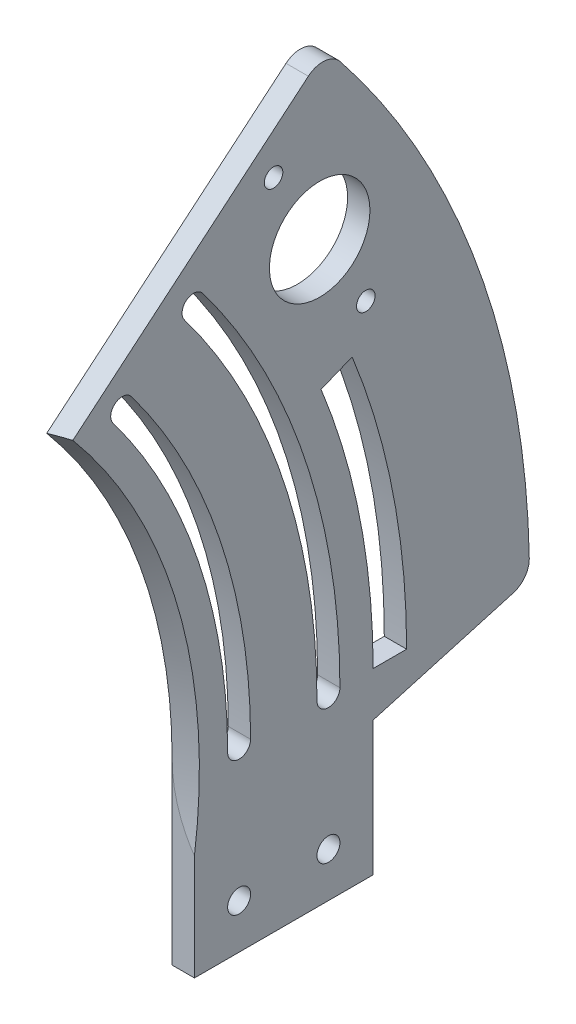
ISO-10303-21;
HEADER;
FILE_DESCRIPTION(('STEP AP214'),'2;1');
FILE_NAME('part.step','',(''),(''),'','','');
FILE_SCHEMA(('AUTOMOTIVE_DESIGN { 1 0 10303 214 1 1 1 1 }'));
ENDSEC;
DATA;
#1=APPLICATION_CONTEXT('core data for automotive mechanical design processes');
#2=APPLICATION_PROTOCOL_DEFINITION('international standard','automotive_design',2000,#1);
#3=PRODUCT_CONTEXT('',#1,'mechanical');
#4=PRODUCT('Part','Part','',(#3));
#5=PRODUCT_RELATED_PRODUCT_CATEGORY('part','',(#4));
#6=PRODUCT_DEFINITION_FORMATION('','',#4);
#7=PRODUCT_DEFINITION_CONTEXT('part definition',#1,'design');
#8=PRODUCT_DEFINITION('design','',#6,#7);
#9=PRODUCT_DEFINITION_SHAPE('','',#8);
#10=(LENGTH_UNIT() NAMED_UNIT(*) SI_UNIT(.MILLI.,.METRE.));
#11=(NAMED_UNIT(*) PLANE_ANGLE_UNIT() SI_UNIT($,.RADIAN.));
#12=(NAMED_UNIT(*) SI_UNIT($,.STERADIAN.) SOLID_ANGLE_UNIT());
#13=UNCERTAINTY_MEASURE_WITH_UNIT(LENGTH_MEASURE(1.E-05),#10,'distance_accuracy_value','');
#14=(GEOMETRIC_REPRESENTATION_CONTEXT(3) GLOBAL_UNCERTAINTY_ASSIGNED_CONTEXT((#13)) GLOBAL_UNIT_ASSIGNED_CONTEXT((#10,
#11,#12)) REPRESENTATION_CONTEXT('',''));
#15=CARTESIAN_POINT('',(0.,0.,0.));
#16=DIRECTION('',(0.,0.,1.));
#17=DIRECTION('',(1.,0.,0.));
#18=AXIS2_PLACEMENT_3D('',#15,#16,#17);
#19=CARTESIAN_POINT('',(6.35,0.,-152.4));
#20=DIRECTION('',(0.,0.,-1.));
#21=DIRECTION('',(0.,1.,0.));
#22=AXIS2_PLACEMENT_3D('',#19,#20,#21);
#23=PLANE('',#22);
#24=CARTESIAN_POINT('',(7.43971542291661,-22.1866370505546,-152.4));
#25=CARTESIAN_POINT('',(7.93666785588586,-22.8156567818333,-152.4));
#26=CARTESIAN_POINT('',(8.45752809363679,-23.42580109558,-152.4));
#27=CARTESIAN_POINT('',(9.54532799602168,-24.6031838854847,-152.4));
#28=CARTESIAN_POINT('',(10.1122499549092,-25.1704386876566,-152.4));
#29=CARTESIAN_POINT('',(11.2905768356218,-26.257465494336,-152.4));
#30=CARTESIAN_POINT('',(11.9020060930652,-26.7772111662092,-152.4));
#31=CARTESIAN_POINT('',(13.1660651043215,-27.763450614783,-152.4));
#32=CARTESIAN_POINT('',(13.8186775769817,-28.2299664998326,-152.4));
#33=CARTESIAN_POINT('',(15.1655425197375,-29.1072372419592,-152.4));
#34=CARTESIAN_POINT('',(15.8600035515539,-29.5176725670453,-152.4));
#35=CARTESIAN_POINT('',(17.2826412717875,-30.2745493064391,-152.4));
#36=CARTESIAN_POINT('',(18.0108030672583,-30.6210186569919,-152.4));
#37=CARTESIAN_POINT('',(19.4958103496898,-31.2455302990343,-152.4));
#38=CARTESIAN_POINT('',(20.2526509932261,-31.5235840859665,-152.4));
#39=CARTESIAN_POINT('',(21.7891063582499,-32.0073614760549,-152.4));
#40=CARTESIAN_POINT('',(22.5687191189811,-32.2130912867826,-152.4));
#41=CARTESIAN_POINT('',(24.0824256917947,-32.5360181627311,-152.4));
#42=CARTESIAN_POINT('',(24.815315465726,-32.6588775236629,-152.4));
#43=CARTESIAN_POINT('',(26.2891068191303,-32.8389120473148,-152.4));
#44=CARTESIAN_POINT('',(27.0300079036923,-32.8960912443915,-152.4));
#45=CARTESIAN_POINT('',(28.5137504044146,-32.9439899723774,-152.4));
#46=CARTESIAN_POINT('',(29.256591240725,-32.9347274985266,-152.4));
#47=CARTESIAN_POINT('',(30.7384667444174,-32.8499107820937,-152.4));
#48=CARTESIAN_POINT('',(31.4775015028173,-32.7743581322358,-152.4));
#49=CARTESIAN_POINT('',(32.9059812628656,-32.5638785084204,-152.4));
#50=CARTESIAN_POINT('',(33.5959380920013,-32.4324024186271,-152.4));
#51=CARTESIAN_POINT('',(34.962769958874,-32.1125937087136,-152.4));
#52=CARTESIAN_POINT('',(35.6396407055606,-31.9242427643044,-152.4));
#53=CARTESIAN_POINT('',(36.9754478448662,-31.4929122702094,-152.4));
#54=CARTESIAN_POINT('',(37.6343906242775,-31.2499524681965,-152.4));
#55=CARTESIAN_POINT('',(38.9308812671899,-30.7118983522538,-152.4));
#56=CARTESIAN_POINT('',(39.5684209093272,-30.4167842714406,-152.4));
#57=CARTESIAN_POINT('',(40.8368519259167,-29.768003414669,-152.4));
#58=CARTESIAN_POINT('',(41.466991066557,-29.4128649580105,-152.4));
#59=CARTESIAN_POINT('',(42.6974661338707,-28.6540963497028,-152.4));
#60=CARTESIAN_POINT('',(43.2977912422751,-28.2504487751992,-152.4));
#61=CARTESIAN_POINT('',(45.0495105615312,-26.9723823988411,-152.4));
#62=CARTESIAN_POINT('',(46.1524643943067,-26.0304175439331,-152.4));
#63=CARTESIAN_POINT('',(48.3099084615285,-23.900210976901,-152.4));
#64=CARTESIAN_POINT('',(49.3494767719507,-22.6969817364048,-152.4));
#65=CARTESIAN_POINT('',(51.2396215406849,-20.1503733268115,-152.4));
#66=CARTESIAN_POINT('',(52.0901086842529,-18.8069283635584,-152.4));
#67=CARTESIAN_POINT('',(53.6936368407281,-15.8331852538064,-152.4));
#68=CARTESIAN_POINT('',(54.4196296935579,-14.1883017723215,-152.4));
#69=CARTESIAN_POINT('',(55.61898096377,-10.8091797455883,-152.4));
#70=CARTESIAN_POINT('',(56.0922073097868,-9.07489500576542,-152.4));
#71=CARTESIAN_POINT('',(56.8272607358944,-5.34244568190289,-152.4));
#72=CARTESIAN_POINT('',(57.0566014388864,-3.33773305551876,-152.4));
#73=CARTESIAN_POINT('',(57.161931526595,-0.324202190718876,-152.4));
#74=CARTESIAN_POINT('',(57.1571872516546,0.681986853473353,-152.4));
#75=CARTESIAN_POINT('',(57.0681003649799,2.69123242387058,-152.4));
#76=CARTESIAN_POINT('',(56.9837473216926,3.69428852226708,-152.4));
#77=CARTESIAN_POINT('',(56.7277660972275,5.75136066932578,-152.4));
#78=CARTESIAN_POINT('',(56.5511293043283,6.80475410327716,-152.4));
#79=CARTESIAN_POINT('',(56.10821297883,8.89215139603002,-152.4));
#80=CARTESIAN_POINT('',(55.84196812422,9.92616259251308,-152.4));
#81=CARTESIAN_POINT('',(55.2196864106577,11.9675756753174,-152.4));
#82=CARTESIAN_POINT('',(54.8635937329035,12.974960588409,-152.4));
#83=CARTESIAN_POINT('',(54.0621998152898,14.9530931511752,-152.4));
#84=CARTESIAN_POINT('',(53.6169458527125,15.9238598946161,-152.4));
#85=CARTESIAN_POINT('',(52.6563261781526,17.7839969486976,-152.4));
#86=CARTESIAN_POINT('',(52.1442352395638,18.6750560628296,-152.4));
#87=CARTESIAN_POINT('',(51.0395693510279,20.4052865488289,-152.4));
#88=CARTESIAN_POINT('',(50.4470380173007,21.2444856837181,-152.4));
#89=CARTESIAN_POINT('',(49.1836927722547,22.8613034149533,-152.4));
#90=CARTESIAN_POINT('',(48.5129125349395,23.6389482607891,-152.4));
#91=CARTESIAN_POINT('',(47.096228805817,25.1225334943082,-152.4));
#92=CARTESIAN_POINT('',(46.3503391287477,25.8284870202398,-152.4));
#93=CARTESIAN_POINT('',(44.8862347638096,27.0745832568908,-152.4));
#94=CARTESIAN_POINT('',(44.1762596785521,27.6244187555902,-152.4));
#95=CARTESIAN_POINT('',(42.7070267194072,28.6536801527227,-152.4));
#96=CARTESIAN_POINT('',(41.9477784041201,29.1331196488739,-152.4));
#97=CARTESIAN_POINT('',(40.3862666642409,30.0142018654846,-152.4));
#98=CARTESIAN_POINT('',(39.5840440699083,30.4159168157206,-152.4));
#99=CARTESIAN_POINT('',(37.9428662536355,31.1355778835972,-152.4));
#100=CARTESIAN_POINT('',(37.1039169823812,31.4535375136448,-152.4));
#101=CARTESIAN_POINT('',(35.5184614814621,31.9614266667561,-152.4));
#102=CARTESIAN_POINT('',(34.7757028509138,32.1631141990829,-152.4));
#103=CARTESIAN_POINT('',(33.2749333507992,32.4980088352101,-152.4));
#104=CARTESIAN_POINT('',(32.5169244015331,32.6312245055081,-152.4));
#105=CARTESIAN_POINT('',(30.9922075674393,32.8272558234833,-152.4));
#106=CARTESIAN_POINT('',(30.2255038262406,32.890103690269,-152.4));
#107=CARTESIAN_POINT('',(28.6895725060674,32.9445956982807,-152.4));
#108=CARTESIAN_POINT('',(27.9203450270489,32.9362426262808,-152.4));
#109=CARTESIAN_POINT('',(26.4480980960478,32.8520280333186,-152.4));
#110=CARTESIAN_POINT('',(25.7447565385205,32.7816822322951,-152.4));
#111=CARTESIAN_POINT('',(24.3463040845098,32.5817997671605,-152.4));
#112=CARTESIAN_POINT('',(23.65119586678,32.4522443537325,-152.4));
#113=CARTESIAN_POINT('',(22.274573845385,32.1355529631933,-152.4));
#114=CARTESIAN_POINT('',(21.5930541559794,31.9484425189381,-152.4));
#115=CARTESIAN_POINT('',(20.2474973077803,31.5186948712951,-152.4));
#116=CARTESIAN_POINT('',(19.5834668668166,31.2760366684311,-152.4));
#117=CARTESIAN_POINT('',(18.271966666877,30.7357331969523,-152.4));
#118=CARTESIAN_POINT('',(17.6246722595208,30.4376628700127,-152.4));
#119=CARTESIAN_POINT('',(16.3556676599132,29.7908543616429,-152.4));
#120=CARTESIAN_POINT('',(15.7339666699259,29.4420981565053,-152.4));
#121=CARTESIAN_POINT('',(14.5196437652076,28.6974673951734,-152.4));
#122=CARTESIAN_POINT('',(13.9270167577817,28.3016011328485,-152.4));
#123=CARTESIAN_POINT('',(12.7731638301731,27.4661394134961,-152.4));
#124=CARTESIAN_POINT('',(12.2119498634742,27.0265274844927,-152.4));
#125=CARTESIAN_POINT('',(11.0788237569817,26.0697495722056,-152.4));
#126=CARTESIAN_POINT('',(10.5097800034809,25.5491820402064,-152.4));
#127=CARTESIAN_POINT('',(9.41329465019998,24.465809990848,-152.4));
#128=CARTESIAN_POINT('',(8.88586845854402,23.9029899793917,-152.4));
#129=CARTESIAN_POINT('',(7.36877654338411,22.1579550139312,-152.4));
#130=CARTESIAN_POINT('',(6.44373441401042,20.9186842262227,-152.4));
#131=CARTESIAN_POINT('',(4.67202940400926,18.1615146459976,-152.4));
#132=CARTESIAN_POINT('',(3.84961621475843,16.6281508080739,-152.4));
#133=CARTESIAN_POINT('',(2.44031566047689,13.4567849562314,-152.4));
#134=CARTESIAN_POINT('',(1.85354046093501,11.818733539225,-152.4));
#135=CARTESIAN_POINT('',(0.857346411232804,8.26223904404549,-152.4));
#136=CARTESIAN_POINT('',(0.480207318548929,6.33472859162569,-152.4));
#137=CARTESIAN_POINT('',(0.0277483027099325,2.44383004536505,-152.4));
#138=CARTESIAN_POINT('',(-0.0473506026720812,0.480416734572018,-152.4));
#139=CARTESIAN_POINT('',(0.110872962432787,-3.59502044722809,-152.4));
#140=CARTESIAN_POINT('',(0.369854582469457,-5.70610176547578,-152.4));
#141=CARTESIAN_POINT('',(1.24170910119018,-9.85304219115794,-152.4));
#142=CARTESIAN_POINT('',(1.85428257240859,-11.8889633953332,-152.4));
#143=CARTESIAN_POINT('',(3.24189655274018,-15.3472342001846,-152.4));
#144=CARTESIAN_POINT('',(3.94255266852539,-16.7994857423205,-152.4));
#145=CARTESIAN_POINT('',(5.14291316337763,-18.8911214482152,-152.4));
#146=CARTESIAN_POINT('',(5.56800164170329,-19.5739688622703,-152.4));
#147=CARTESIAN_POINT('',(6.46729832627976,-20.9064072844126,-152.4));
#148=CARTESIAN_POINT('',(6.94149173540168,-21.5560082232345,-152.4));
#149=CARTESIAN_POINT('',(7.43971542291661,-22.1866370505546,-152.4));
#150=B_SPLINE_CURVE_WITH_KNOTS('',3,(#24,#25,#26,#27,#28,#29,#30,#31,#32,#33,#34,#35,#36,#37,
#38,#39,#40,#41,#42,#43,#44,#45,#46,#47,#48,#49,#50,#51,#52,#53,#54,#55,#56,#57,#58,#59,#60,#61,
#62,#63,#64,#65,#66,#67,#68,#69,#70,#71,#72,#73,#74,#75,#76,#77,#78,#79,#80,#81,#82,#83,#84,#85,
#86,#87,#88,#89,#90,#91,#92,#93,#94,#95,#96,#97,#98,#99,#100,#101,#102,#103,#104,#105,#106,#107,
#108,#109,#110,#111,#112,#113,#114,#115,#116,#117,#118,#119,#120,#121,#122,#123,#124,#125,#126,
#127,#128,#129,#130,#131,#132,#133,#134,#135,#136,#137,#138,#139,#140,#141,#142,#143,#144,#145,
#146,#147,#148,#149),.UNSPECIFIED.,.T.,.F.,(4,2,2,2,2,2,2,2,2,2,2,2,2,2,2,2,2,2,2,2,2,2,2,2,2,2,
2,2,2,2,2,2,2,2,2,2,2,2,2,2,2,2,2,2,2,2,2,2,2,2,2,2,2,2,2,2,2,2,2,2,2,2,4),(0.,2.40431666955021,
4.80771347274791,7.2124344173738,9.61615292632316,12.0330419133385,14.448872847935,
16.8642975878323,19.2795149610261,21.5059856444382,23.7323195611839,25.9580505144649,
28.1837279925747,30.2884164212609,32.3937836761886,34.498390808949,36.6037973218259,
38.7713747103805,40.9397329602101,45.2737236563409,50.0255164880407,54.7795491391421,
60.1517094500895,65.5266739941354,71.5516556162412,74.5677446487649,77.584228950076,
80.7846680909846,83.9838700952023,87.1850645485788,90.3845660595127,93.4634856963305,
96.5407425065148,99.6166798871727,102.692052546257,105.382143903581,108.071714956341,
110.758774445326,113.445400159955,115.751301284019,118.056913847103,120.361470313587,
122.665936581135,124.783984340144,126.902703265403,129.020483626042,131.139065926122,
133.274625570736,135.410946478856,137.546891836012,139.683644526577,141.994874539173,
144.306956265268,148.928921053339,154.128609079264,159.33076927105,165.198240808714,
171.07000508576,177.420757281298,183.766139427422,188.587128130516,190.998319763449,
193.408786918021),.UNSPECIFIED.);
#151=CARTESIAN_POINT('',(0.,0.,-152.4));
#152=VERTEX_POINT('',#151);
#153=CARTESIAN_POINT('',(6.35000000001112,-20.7231993640405,-152.4));
#154=VERTEX_POINT('',#153);
#155=EDGE_CURVE('E262',#152,#154,#150,.T.);
#156=ORIENTED_EDGE('',*,*,#155,.F.);
#157=DIRECTION('',(0.,-1.,0.));
#158=VECTOR('',#157,1.);
#159=CARTESIAN_POINT('',(0.,0.,-152.4));
#160=LINE('',#159,#158);
#161=CARTESIAN_POINT('',(0.,-50.8,-152.4));
#162=VERTEX_POINT('',#161);
#163=EDGE_CURVE('E236',#152,#162,#160,.T.);
#164=ORIENTED_EDGE('',*,*,#163,.T.);
#165=DIRECTION('',(-1.,0.,0.));
#166=VECTOR('',#165,1.);
#167=CARTESIAN_POINT('',(6.35,-50.8,-152.4));
#168=LINE('',#167,#166);
#169=CARTESIAN_POINT('',(6.35,-50.8,-152.4));
#170=VERTEX_POINT('',#169);
#171=EDGE_CURVE('E246',#170,#162,#168,.T.);
#172=ORIENTED_EDGE('',*,*,#171,.F.);
#173=DIRECTION('',(0.,-1.,0.));
#174=VECTOR('',#173,1.);
#175=CARTESIAN_POINT('',(6.35,0.,-152.4));
#176=LINE('',#175,#174);
#177=EDGE_CURVE('E217',#154,#170,#176,.T.);
#178=ORIENTED_EDGE('',*,*,#177,.F.);
#179=EDGE_LOOP('',(#156,#164,#172,#178));
#180=FACE_BOUND('',#179,.T.);
#181=ADVANCED_FACE('F38',(#180),#23,.F.);
#182=CARTESIAN_POINT('',(6.35,0.,0.));
#183=DIRECTION('',(-1.,0.,0.));
#184=DIRECTION('',(0.,0.,1.));
#185=AXIS2_PLACEMENT_3D('',#182,#183,#184);
#186=PLANE('',#185);
#187=DIRECTION('',(0.,-0.274721127897378,0.961523947640823));
#188=VECTOR('',#187,1.);
#189=CARTESIAN_POINT('',(6.35,0.,-247.65));
#190=LINE('',#189,#188);
#191=CARTESIAN_POINT('',(6.35,-1.3293704907179,-242.997203282487));
#192=VERTEX_POINT('',#191);
#193=CARTESIAN_POINT('',(6.35,-12.7,-203.2));
#194=VERTEX_POINT('',#193);
#195=EDGE_CURVE('E189',#192,#194,#190,.T.);
#196=ORIENTED_EDGE('',*,*,#195,.F.);
#197=CARTESIAN_POINT('',(6.35,4.77630657680132,-241.252724120339));
#198=DIRECTION('',(-1.,0.,0.));
#199=DIRECTION('',(0.,0.,1.));
#200=AXIS2_PLACEMENT_3D('',#197,#198,#199);
#201=CIRCLE('',#200,6.35);
#202=CARTESIAN_POINT('',(6.35,4.9019988551382,-247.601480018243));
#203=VERTEX_POINT('',#202);
#204=EDGE_CURVE('E11',#192,#203,#201,.F.);
#205=ORIENTED_EDGE('',*,*,#204,.T.);
#206=CARTESIAN_POINT('',(6.35,0.,0.));
#207=DIRECTION('',(1.,0.,0.));
#208=DIRECTION('',(0.,0.,1.));
#209=AXIS2_PLACEMENT_3D('',#206,#207,#208);
#210=CIRCLE('',#209,247.65);
#211=CARTESIAN_POINT('',(6.35,154.138829792761,-193.834320103841));
#212=VERTEX_POINT('',#211);
#213=EDGE_CURVE('E207',#203,#212,#210,.T.);
#214=ORIENTED_EDGE('',*,*,#213,.T.);
#215=CARTESIAN_POINT('',(6.35,150.186552105767,-188.864209331948));
#216=DIRECTION('',(-1.,0.,0.));
#217=DIRECTION('',(0.,0.,1.));
#218=AXIS2_PLACEMENT_3D('',#215,#216,#217);
#219=CIRCLE('',#218,6.35);
#220=CARTESIAN_POINT('',(6.35,155.050934319572,-184.782508010438));
#221=VERTEX_POINT('',#220);
#222=EDGE_CURVE('E260',#212,#221,#219,.F.);
#223=ORIENTED_EDGE('',*,*,#222,.T.);
#224=DIRECTION('',(0.,-0.64278760968654,0.766044443118977));
#225=VECTOR('',#224,1.);
#226=CARTESIAN_POINT('',(6.35,130.614442288305,-155.660230841776));
#227=LINE('',#226,#225);
#228=CARTESIAN_POINT('',(6.35000000000001,98.8623454880934,-117.819555407725));
#229=VERTEX_POINT('',#228);
#230=EDGE_CURVE('E209',#221,#229,#227,.T.);
#231=ORIENTED_EDGE('',*,*,#230,.T.);
#232=CARTESIAN_POINT('',(6.35,0.,0.));
#233=DIRECTION('',(-1.,0.,0.));
#234=DIRECTION('',(0.,0.,1.));
#235=AXIS2_PLACEMENT_3D('',#232,#233,#234);
#236=CIRCLE('',#235,153.802506455133);
#237=EDGE_CURVE('E373',#154,#229,#236,.F.);
#238=ORIENTED_EDGE('',*,*,#237,.F.);
#239=ORIENTED_EDGE('',*,*,#177,.T.);
#240=DIRECTION('',(0.,0.,-1.));
#241=VECTOR('',#240,1.);
#242=CARTESIAN_POINT('',(6.35,-50.8,-152.4));
#243=LINE('',#242,#241);
#244=CARTESIAN_POINT('',(6.35,-50.8,-203.2));
#245=VERTEX_POINT('',#244);
#246=EDGE_CURVE('E219',#170,#245,#243,.T.);
#247=ORIENTED_EDGE('',*,*,#246,.T.);
#248=DIRECTION('',(0.,1.,0.));
#249=VECTOR('',#248,1.);
#250=CARTESIAN_POINT('',(6.35,-50.8,-203.2));
#251=LINE('',#250,#249);
#252=EDGE_CURVE('E221',#245,#194,#251,.T.);
#253=ORIENTED_EDGE('',*,*,#252,.T.);
#254=EDGE_LOOP('',(#196,#205,#214,#223,#231,#238,#239,#247,#253));
#255=FACE_BOUND('',#254,.T.);
#256=DIRECTION('',(0.,0.374670154629101,-0.92715817163535));
#257=VECTOR('',#256,1.);
#258=CARTESIAN_POINT('',(6.35,76.1329754206333,-188.398540476303));
#259=LINE('',#258,#257);
#260=CARTESIAN_POINT('',(6.35,76.1329754206333,-188.398540476303));
#261=VERTEX_POINT('',#260);
#262=CARTESIAN_POINT('',(6.35,79.7017086434755,-197.22972206113));
#263=VERTEX_POINT('',#262);
#264=EDGE_CURVE('E197',#261,#263,#259,.T.);
#265=ORIENTED_EDGE('',*,*,#264,.T.);
#266=CARTESIAN_POINT('',(6.35,0.,0.));
#267=DIRECTION('',(1.,0.,0.));
#268=DIRECTION('',(0.,0.,-1.));
#269=AXIS2_PLACEMENT_3D('',#266,#267,#268);
#270=CIRCLE('',#269,212.725);
#271=CARTESIAN_POINT('',(6.35,0.,-212.725));
#272=VERTEX_POINT('',#271);
#273=EDGE_CURVE('E178',#272,#263,#270,.T.);
#274=ORIENTED_EDGE('',*,*,#273,.F.);
#275=DIRECTION('',(0.,0.,-1.));
#276=VECTOR('',#275,1.);
#277=CARTESIAN_POINT('',(6.35,0.,-212.725));
#278=LINE('',#277,#276);
#279=CARTESIAN_POINT('',(6.35,0.,-203.2));
#280=VERTEX_POINT('',#279);
#281=EDGE_CURVE('E201',#280,#272,#278,.T.);
#282=ORIENTED_EDGE('',*,*,#281,.F.);
#283=CARTESIAN_POINT('',(6.35,0.,0.));
#284=DIRECTION('',(1.,0.,0.));
#285=DIRECTION('',(0.,0.,1.));
#286=AXIS2_PLACEMENT_3D('',#283,#284,#285);
#287=CIRCLE('',#286,203.2);
#288=EDGE_CURVE('E205',#280,#261,#287,.T.);
#289=ORIENTED_EDGE('',*,*,#288,.T.);
#290=EDGE_LOOP('',(#265,#274,#282,#289));
#291=FACE_BOUND('',#290,.T.);
#292=CARTESIAN_POINT('',(6.35,-38.1,-165.1));
#293=DIRECTION('',(1.,0.,0.));
#294=DIRECTION('',(0.,0.,-1.));
#295=AXIS2_PLACEMENT_3D('',#292,#293,#294);
#296=CIRCLE('',#295,3.26389999999998);
#297=CARTESIAN_POINT('',(6.35,-38.1,-168.3639));
#298=VERTEX_POINT('',#297);
#299=EDGE_CURVE('E388',#298,#298,#296,.T.);
#300=ORIENTED_EDGE('',*,*,#299,.F.);
#301=EDGE_LOOP('',(#300));
#302=FACE_BOUND('',#301,.T.);
#303=CARTESIAN_POINT('',(6.35,-38.1,-190.5));
#304=DIRECTION('',(1.,0.,0.));
#305=DIRECTION('',(0.,0.,-1.));
#306=AXIS2_PLACEMENT_3D('',#303,#304,#305);
#307=CIRCLE('',#306,3.26390000000001);
#308=CARTESIAN_POINT('',(6.35,-38.1,-193.7639));
#309=VERTEX_POINT('',#308);
#310=EDGE_CURVE('E376',#309,#309,#307,.T.);
#311=ORIENTED_EDGE('',*,*,#310,.F.);
#312=EDGE_LOOP('',(#311));
#313=FACE_BOUND('',#312,.T.);
#314=CARTESIAN_POINT('',(6.35,0.,-190.5));
#315=DIRECTION('',(1.,0.,0.));
#316=DIRECTION('',(0.,0.,-1.));
#317=AXIS2_PLACEMENT_3D('',#314,#315,#316);
#318=CIRCLE('',#317,3.2639);
#319=CARTESIAN_POINT('',(6.35,0.,-187.2361));
#320=VERTEX_POINT('',#319);
#321=CARTESIAN_POINT('',(6.35,0.,-193.7639));
#322=VERTEX_POINT('',#321);
#323=EDGE_CURVE('E408',#320,#322,#318,.T.);
#324=ORIENTED_EDGE('',*,*,#323,.F.);
#325=CARTESIAN_POINT('',(6.35,0.,0.));
#326=DIRECTION('',(-1.,0.,0.));
#327=DIRECTION('',(0.,0.,1.));
#328=AXIS2_PLACEMENT_3D('',#325,#326,#327);
#329=CIRCLE('',#328,187.2361);
#330=CARTESIAN_POINT('',(6.35,112.681497856399,-149.533398222766));
#331=VERTEX_POINT('',#330);
#332=EDGE_CURVE('E387',#331,#320,#329,.T.);
#333=ORIENTED_EDGE('',*,*,#332,.F.);
#334=CARTESIAN_POINT('',(6.35,114.645761910465,-152.140064664009));
#335=DIRECTION('',(1.,0.,0.));
#336=DIRECTION('',(0.,0.,-1.));
#337=AXIS2_PLACEMENT_3D('',#334,#335,#336);
#338=CIRCLE('',#337,3.2639);
#339=CARTESIAN_POINT('',(6.35,116.610025964531,-154.746731105252));
#340=VERTEX_POINT('',#339);
#341=EDGE_CURVE('E397',#340,#331,#338,.T.);
#342=ORIENTED_EDGE('',*,*,#341,.F.);
#343=CARTESIAN_POINT('',(6.35,0.,0.));
#344=DIRECTION('',(1.,0.,0.));
#345=DIRECTION('',(0.,0.,1.));
#346=AXIS2_PLACEMENT_3D('',#343,#344,#345);
#347=CIRCLE('',#346,193.7639);
#348=EDGE_CURVE('E411',#322,#340,#347,.T.);
#349=ORIENTED_EDGE('',*,*,#348,.F.);
#350=EDGE_LOOP('',(#324,#333,#342,#349));
#351=FACE_BOUND('',#350,.T.);
#352=CARTESIAN_POINT('',(6.35,0.,-165.1));
#353=DIRECTION('',(1.,0.,0.));
#354=DIRECTION('',(0.,0.,-1.));
#355=AXIS2_PLACEMENT_3D('',#352,#353,#354);
#356=CIRCLE('',#355,3.2639);
#357=CARTESIAN_POINT('',(6.35,0.,-161.8361));
#358=VERTEX_POINT('',#357);
#359=CARTESIAN_POINT('',(6.35,0.,-168.3639));
#360=VERTEX_POINT('',#359);
#361=EDGE_CURVE('E440',#358,#360,#356,.T.);
#362=ORIENTED_EDGE('',*,*,#361,.F.);
#363=CARTESIAN_POINT('',(6.35,0.,0.));
#364=DIRECTION('',(-1.,0.,0.));
#365=DIRECTION('',(0.,0.,1.));
#366=AXIS2_PLACEMENT_3D('',#363,#364,#365);
#367=CIRCLE('',#366,161.8361);
#368=CARTESIAN_POINT('',(6.35,97.3953962683374,-129.248056267565));
#369=VERTEX_POINT('',#368);
#370=EDGE_CURVE('E418',#369,#358,#367,.T.);
#371=ORIENTED_EDGE('',*,*,#370,.F.);
#372=CARTESIAN_POINT('',(6.35,99.3596603224034,-131.854722708808));
#373=DIRECTION('',(1.,0.,0.));
#374=DIRECTION('',(0.,0.,-1.));
#375=AXIS2_PLACEMENT_3D('',#372,#373,#374);
#376=CIRCLE('',#375,3.2639);
#377=CARTESIAN_POINT('',(6.35,101.323924376469,-134.461389150051));
#378=VERTEX_POINT('',#377);
#379=EDGE_CURVE('E429',#378,#369,#376,.T.);
#380=ORIENTED_EDGE('',*,*,#379,.F.);
#381=CARTESIAN_POINT('',(6.35,0.,0.));
#382=DIRECTION('',(1.,0.,0.));
#383=DIRECTION('',(0.,0.,1.));
#384=AXIS2_PLACEMENT_3D('',#381,#382,#383);
#385=CIRCLE('',#384,168.3639);
#386=EDGE_CURVE('E443',#360,#378,#385,.T.);
#387=ORIENTED_EDGE('',*,*,#386,.F.);
#388=EDGE_LOOP('',(#362,#371,#380,#387));
#389=FACE_BOUND('',#388,.T.);
#390=CARTESIAN_POINT('',(6.35,113.300555850684,-188.005902274812));
#391=DIRECTION('',(1.,0.,0.));
#392=DIRECTION('',(0.,0.,-1.));
#393=AXIS2_PLACEMENT_3D('',#390,#391,#392);
#394=CIRCLE('',#393,14.2875);
#395=CARTESIAN_POINT('',(6.35,113.300555850684,-202.293402274812));
#396=VERTEX_POINT('',#395);
#397=EDGE_CURVE('E227',#396,#396,#394,.T.);
#398=ORIENTED_EDGE('',*,*,#397,.F.);
#399=EDGE_LOOP('',(#398));
#400=FACE_BOUND('',#399,.T.);
#401=CARTESIAN_POINT('',(6.35,135.055462385608,-174.895446841962));
#402=DIRECTION('',(1.,0.,0.));
#403=DIRECTION('',(0.,0.,-1.));
#404=AXIS2_PLACEMENT_3D('',#401,#402,#403);
#405=CIRCLE('',#404,2.62889999999999);
#406=CARTESIAN_POINT('',(6.35,135.055462385608,-177.524346841962));
#407=VERTEX_POINT('',#406);
#408=EDGE_CURVE('E463',#407,#407,#405,.T.);
#409=ORIENTED_EDGE('',*,*,#408,.F.);
#410=EDGE_LOOP('',(#409));
#411=FACE_BOUND('',#410,.T.);
#412=CARTESIAN_POINT('',(6.35,91.54564931576,-201.116357707661));
#413=DIRECTION('',(1.,0.,0.));
#414=DIRECTION('',(0.,0.,-1.));
#415=AXIS2_PLACEMENT_3D('',#412,#413,#414);
#416=CIRCLE('',#415,2.62889999999999);
#417=CARTESIAN_POINT('',(6.35,91.54564931576,-203.745257707661));
#418=VERTEX_POINT('',#417);
#419=EDGE_CURVE('E457',#418,#418,#416,.T.);
#420=ORIENTED_EDGE('',*,*,#419,.F.);
#421=EDGE_LOOP('',(#420));
#422=FACE_BOUND('',#421,.T.);
#423=ADVANCED_FACE('F203',(#255,#291,#302,#313,#351,#389,#400,#411,#422),#186,.F.);
#424=CARTESIAN_POINT('',(0.,0.,0.));
#425=DIRECTION('',(-1.,0.,0.));
#426=DIRECTION('',(0.,0.,1.));
#427=AXIS2_PLACEMENT_3D('',#424,#425,#426);
#428=PLANE('',#427);
#429=CARTESIAN_POINT('',(0.,0.,0.));
#430=DIRECTION('',(1.,0.,0.));
#431=DIRECTION('',(0.,0.,1.));
#432=AXIS2_PLACEMENT_3D('',#429,#430,#431);
#433=CIRCLE('',#432,247.65);
#434=CARTESIAN_POINT('',(0.,4.9019988551382,-247.601480018243));
#435=VERTEX_POINT('',#434);
#436=CARTESIAN_POINT('',(0.,154.138829792761,-193.834320103841));
#437=VERTEX_POINT('',#436);
#438=EDGE_CURVE('E229',#435,#437,#433,.T.);
#439=ORIENTED_EDGE('',*,*,#438,.F.);
#440=CARTESIAN_POINT('',(0.,4.77630657680132,-241.252724120339));
#441=DIRECTION('',(-1.,0.,0.));
#442=DIRECTION('',(0.,0.,1.));
#443=AXIS2_PLACEMENT_3D('',#440,#441,#442);
#444=CIRCLE('',#443,6.35);
#445=CARTESIAN_POINT('',(0.,-1.3293704907179,-242.997203282487));
#446=VERTEX_POINT('',#445);
#447=EDGE_CURVE('E60',#435,#446,#444,.T.);
#448=ORIENTED_EDGE('',*,*,#447,.T.);
#449=DIRECTION('',(0.,-0.274721127897378,0.961523947640823));
#450=VECTOR('',#449,1.);
#451=CARTESIAN_POINT('',(0.,0.,-247.65));
#452=LINE('',#451,#450);
#453=CARTESIAN_POINT('',(0.,-12.7,-203.2));
#454=VERTEX_POINT('',#453);
#455=EDGE_CURVE('E491',#446,#454,#452,.T.);
#456=ORIENTED_EDGE('',*,*,#455,.T.);
#457=DIRECTION('',(0.,1.,0.));
#458=VECTOR('',#457,1.);
#459=CARTESIAN_POINT('',(0.,-50.8,-203.2));
#460=LINE('',#459,#458);
#461=CARTESIAN_POINT('',(0.,-50.8,-203.2));
#462=VERTEX_POINT('',#461);
#463=EDGE_CURVE('E211',#462,#454,#460,.T.);
#464=ORIENTED_EDGE('',*,*,#463,.F.);
#465=DIRECTION('',(0.,0.,-1.));
#466=VECTOR('',#465,1.);
#467=CARTESIAN_POINT('',(0.,-50.8,-152.4));
#468=LINE('',#467,#466);
#469=EDGE_CURVE('E238',#162,#462,#468,.T.);
#470=ORIENTED_EDGE('',*,*,#469,.F.);
#471=ORIENTED_EDGE('',*,*,#163,.F.);
#472=CARTESIAN_POINT('',(0.,0.,0.));
#473=DIRECTION('',(-1.,0.,0.));
#474=DIRECTION('',(0.,0.,-1.));
#475=AXIS2_PLACEMENT_3D('',#472,#473,#474);
#476=CIRCLE('',#475,152.4);
#477=CARTESIAN_POINT('',(0.,97.9608317162289,-116.745173131332));
#478=VERTEX_POINT('',#477);
#479=EDGE_CURVE('E234',#478,#152,#476,.T.);
#480=ORIENTED_EDGE('',*,*,#479,.F.);
#481=DIRECTION('',(0.,-0.642787609686541,0.766044443118977));
#482=VECTOR('',#481,1.);
#483=CARTESIAN_POINT('',(0.,97.9608317162289,-116.745173131332));
#484=LINE('',#483,#482);
#485=CARTESIAN_POINT('',(0.,155.050934319572,-184.782508010438));
#486=VERTEX_POINT('',#485);
#487=EDGE_CURVE('E231',#486,#478,#484,.T.);
#488=ORIENTED_EDGE('',*,*,#487,.F.);
#489=CARTESIAN_POINT('',(0.,150.186552105767,-188.864209331948));
#490=DIRECTION('',(-1.,0.,0.));
#491=DIRECTION('',(0.,0.,1.));
#492=AXIS2_PLACEMENT_3D('',#489,#490,#491);
#493=CIRCLE('',#492,6.35);
#494=EDGE_CURVE('E254',#486,#437,#493,.T.);
#495=ORIENTED_EDGE('',*,*,#494,.T.);
#496=EDGE_LOOP('',(#439,#448,#456,#464,#470,#471,#480,#488,#495));
#497=FACE_BOUND('',#496,.T.);
#498=CARTESIAN_POINT('',(0.,-38.1,-165.1));
#499=DIRECTION('',(1.,0.,0.));
#500=DIRECTION('',(0.,0.,-1.));
#501=AXIS2_PLACEMENT_3D('',#498,#499,#500);
#502=CIRCLE('',#501,3.26389999999998);
#503=CARTESIAN_POINT('',(0.,-38.1,-168.3639));
#504=VERTEX_POINT('',#503);
#505=EDGE_CURVE('E384',#504,#504,#502,.T.);
#506=ORIENTED_EDGE('',*,*,#505,.T.);
#507=EDGE_LOOP('',(#506));
#508=FACE_BOUND('',#507,.T.);
#509=CARTESIAN_POINT('',(0.,-38.1,-190.5));
#510=DIRECTION('',(1.,0.,0.));
#511=DIRECTION('',(0.,0.,-1.));
#512=AXIS2_PLACEMENT_3D('',#509,#510,#511);
#513=CIRCLE('',#512,3.26390000000001);
#514=CARTESIAN_POINT('',(0.,-38.1,-193.7639));
#515=VERTEX_POINT('',#514);
#516=EDGE_CURVE('E380',#515,#515,#513,.T.);
#517=ORIENTED_EDGE('',*,*,#516,.T.);
#518=EDGE_LOOP('',(#517));
#519=FACE_BOUND('',#518,.T.);
#520=CARTESIAN_POINT('',(0.,0.,0.));
#521=DIRECTION('',(-1.,0.,0.));
#522=DIRECTION('',(0.,0.,1.));
#523=AXIS2_PLACEMENT_3D('',#520,#521,#522);
#524=CIRCLE('',#523,187.2361);
#525=CARTESIAN_POINT('',(0.,112.681497856399,-149.533398222766));
#526=VERTEX_POINT('',#525);
#527=CARTESIAN_POINT('',(0.,0.,-187.2361));
#528=VERTEX_POINT('',#527);
#529=EDGE_CURVE('E393',#526,#528,#524,.T.);
#530=ORIENTED_EDGE('',*,*,#529,.T.);
#531=CARTESIAN_POINT('',(0.,0.,-190.5));
#532=DIRECTION('',(1.,0.,0.));
#533=DIRECTION('',(0.,0.,-1.));
#534=AXIS2_PLACEMENT_3D('',#531,#532,#533);
#535=CIRCLE('',#534,3.2639);
#536=CARTESIAN_POINT('',(0.,0.,-193.7639));
#537=VERTEX_POINT('',#536);
#538=EDGE_CURVE('E396',#528,#537,#535,.T.);
#539=ORIENTED_EDGE('',*,*,#538,.T.);
#540=CARTESIAN_POINT('',(0.,0.,0.));
#541=DIRECTION('',(1.,0.,0.));
#542=DIRECTION('',(0.,0.,1.));
#543=AXIS2_PLACEMENT_3D('',#540,#541,#542);
#544=CIRCLE('',#543,193.7639);
#545=CARTESIAN_POINT('',(0.,116.610025964531,-154.746731105252));
#546=VERTEX_POINT('',#545);
#547=EDGE_CURVE('E400',#537,#546,#544,.T.);
#548=ORIENTED_EDGE('',*,*,#547,.T.);
#549=CARTESIAN_POINT('',(0.,114.645761910465,-152.140064664009));
#550=DIRECTION('',(1.,0.,0.));
#551=DIRECTION('',(0.,0.,-1.));
#552=AXIS2_PLACEMENT_3D('',#549,#550,#551);
#553=CIRCLE('',#552,3.2639);
#554=EDGE_CURVE('E403',#546,#526,#553,.T.);
#555=ORIENTED_EDGE('',*,*,#554,.T.);
#556=EDGE_LOOP('',(#530,#539,#548,#555));
#557=FACE_BOUND('',#556,.T.);
#558=CARTESIAN_POINT('',(0.,0.,0.));
#559=DIRECTION('',(-1.,0.,0.));
#560=DIRECTION('',(0.,0.,1.));
#561=AXIS2_PLACEMENT_3D('',#558,#559,#560);
#562=CIRCLE('',#561,161.8361);
#563=CARTESIAN_POINT('',(0.,97.3953962683374,-129.248056267565));
#564=VERTEX_POINT('',#563);
#565=CARTESIAN_POINT('',(0.,0.,-161.8361));
#566=VERTEX_POINT('',#565);
#567=EDGE_CURVE('E425',#564,#566,#562,.T.);
#568=ORIENTED_EDGE('',*,*,#567,.T.);
#569=CARTESIAN_POINT('',(0.,0.,-165.1));
#570=DIRECTION('',(1.,0.,0.));
#571=DIRECTION('',(0.,0.,-1.));
#572=AXIS2_PLACEMENT_3D('',#569,#570,#571);
#573=CIRCLE('',#572,3.2639);
#574=CARTESIAN_POINT('',(0.,0.,-168.3639));
#575=VERTEX_POINT('',#574);
#576=EDGE_CURVE('E428',#566,#575,#573,.T.);
#577=ORIENTED_EDGE('',*,*,#576,.T.);
#578=CARTESIAN_POINT('',(0.,0.,0.));
#579=DIRECTION('',(1.,0.,0.));
#580=DIRECTION('',(0.,0.,1.));
#581=AXIS2_PLACEMENT_3D('',#578,#579,#580);
#582=CIRCLE('',#581,168.3639);
#583=CARTESIAN_POINT('',(0.,101.323924376469,-134.461389150051));
#584=VERTEX_POINT('',#583);
#585=EDGE_CURVE('E432',#575,#584,#582,.T.);
#586=ORIENTED_EDGE('',*,*,#585,.T.);
#587=CARTESIAN_POINT('',(0.,99.3596603224034,-131.854722708808));
#588=DIRECTION('',(1.,0.,0.));
#589=DIRECTION('',(0.,0.,-1.));
#590=AXIS2_PLACEMENT_3D('',#587,#588,#589);
#591=CIRCLE('',#590,3.2639);
#592=EDGE_CURVE('E435',#584,#564,#591,.T.);
#593=ORIENTED_EDGE('',*,*,#592,.T.);
#594=EDGE_LOOP('',(#568,#577,#586,#593));
#595=FACE_BOUND('',#594,.T.);
#596=CARTESIAN_POINT('',(0.,135.055462385608,-174.895446841962));
#597=DIRECTION('',(1.,0.,0.));
#598=DIRECTION('',(0.,0.,-1.));
#599=AXIS2_PLACEMENT_3D('',#596,#597,#598);
#600=CIRCLE('',#599,2.62889999999999);
#601=CARTESIAN_POINT('',(0.,135.055462385608,-177.524346841962));
#602=VERTEX_POINT('',#601);
#603=EDGE_CURVE('E460',#602,#602,#600,.T.);
#604=ORIENTED_EDGE('',*,*,#603,.T.);
#605=EDGE_LOOP('',(#604));
#606=FACE_BOUND('',#605,.T.);
#607=CARTESIAN_POINT('',(0.,0.,0.));
#608=DIRECTION('',(1.,0.,0.));
#609=DIRECTION('',(0.,0.,-1.));
#610=AXIS2_PLACEMENT_3D('',#607,#608,#609);
#611=CIRCLE('',#610,212.725);
#612=CARTESIAN_POINT('',(0.,0.,-212.725));
#613=VERTEX_POINT('',#612);
#614=CARTESIAN_POINT('',(0.,79.7017086434755,-197.22972206113));
#615=VERTEX_POINT('',#614);
#616=EDGE_CURVE('E488',#613,#615,#611,.T.);
#617=ORIENTED_EDGE('',*,*,#616,.T.);
#618=DIRECTION('',(0.,0.374670154629101,-0.92715817163535));
#619=VECTOR('',#618,1.);
#620=CARTESIAN_POINT('',(0.,76.1329754206333,-188.398540476303));
#621=LINE('',#620,#619);
#622=CARTESIAN_POINT('',(0.,76.1329754206333,-188.398540476303));
#623=VERTEX_POINT('',#622);
#624=EDGE_CURVE('E199',#623,#615,#621,.T.);
#625=ORIENTED_EDGE('',*,*,#624,.F.);
#626=CARTESIAN_POINT('',(0.,0.,0.));
#627=DIRECTION('',(1.,0.,0.));
#628=DIRECTION('',(0.,0.,-1.));
#629=AXIS2_PLACEMENT_3D('',#626,#627,#628);
#630=CIRCLE('',#629,203.2);
#631=CARTESIAN_POINT('',(0.,0.,-203.2));
#632=VERTEX_POINT('',#631);
#633=EDGE_CURVE('E225',#632,#623,#630,.T.);
#634=ORIENTED_EDGE('',*,*,#633,.F.);
#635=DIRECTION('',(0.,0.,-1.));
#636=VECTOR('',#635,1.);
#637=CARTESIAN_POINT('',(0.,0.,-212.725));
#638=LINE('',#637,#636);
#639=EDGE_CURVE('E190',#632,#613,#638,.T.);
#640=ORIENTED_EDGE('',*,*,#639,.T.);
#641=EDGE_LOOP('',(#617,#625,#634,#640));
#642=FACE_BOUND('',#641,.T.);
#643=CARTESIAN_POINT('',(0.,113.300555850684,-188.005902274812));
#644=DIRECTION('',(1.,0.,0.));
#645=DIRECTION('',(0.,0.,-1.));
#646=AXIS2_PLACEMENT_3D('',#643,#644,#645);
#647=CIRCLE('',#646,14.2875);
#648=CARTESIAN_POINT('',(0.,113.300555850684,-202.293402274812));
#649=VERTEX_POINT('',#648);
#650=EDGE_CURVE('E466',#649,#649,#647,.T.);
#651=ORIENTED_EDGE('',*,*,#650,.T.);
#652=EDGE_LOOP('',(#651));
#653=FACE_BOUND('',#652,.T.);
#654=CARTESIAN_POINT('',(0.,91.54564931576,-201.116357707661));
#655=DIRECTION('',(1.,0.,0.));
#656=DIRECTION('',(0.,0.,-1.));
#657=AXIS2_PLACEMENT_3D('',#654,#655,#656);
#658=CIRCLE('',#657,2.62889999999999);
#659=CARTESIAN_POINT('',(0.,91.54564931576,-203.745257707661));
#660=VERTEX_POINT('',#659);
#661=EDGE_CURVE('E450',#660,#660,#658,.T.);
#662=ORIENTED_EDGE('',*,*,#661,.T.);
#663=EDGE_LOOP('',(#662));
#664=FACE_BOUND('',#663,.T.);
#665=ADVANCED_FACE('F337',(#497,#508,#519,#557,#595,#606,#642,#653,#664),#428,.T.);
#666=CARTESIAN_POINT('',(6.35,0.,0.));
#667=DIRECTION('',(-1.,0.,0.));
#668=DIRECTION('',(0.,0.,1.));
#669=AXIS2_PLACEMENT_3D('',#666,#667,#668);
#670=CYLINDRICAL_SURFACE('',#669,203.2);
#671=ORIENTED_EDGE('',*,*,#633,.T.);
#672=DIRECTION('',(-1.,0.,0.));
#673=VECTOR('',#672,1.);
#674=CARTESIAN_POINT('',(6.35,76.1329754206333,-188.398540476303));
#675=LINE('',#674,#673);
#676=EDGE_CURVE('E249',#261,#623,#675,.T.);
#677=ORIENTED_EDGE('',*,*,#676,.F.);
#678=ORIENTED_EDGE('',*,*,#288,.F.);
#679=DIRECTION('',(-1.,0.,0.));
#680=VECTOR('',#679,1.);
#681=CARTESIAN_POINT('',(6.35,0.,-203.2));
#682=LINE('',#681,#680);
#683=EDGE_CURVE('E224',#280,#632,#682,.T.);
#684=ORIENTED_EDGE('',*,*,#683,.T.);
#685=EDGE_LOOP('',(#671,#677,#678,#684));
#686=FACE_BOUND('',#685,.T.);
#687=ADVANCED_FACE('F341',(#686),#670,.T.);
#688=CARTESIAN_POINT('',(6.35,76.1329754206333,-188.398540476303));
#689=DIRECTION('',(0.,0.92715817163535,0.374670154629101));
#690=DIRECTION('',(0.,-0.374670154629101,0.92715817163535));
#691=AXIS2_PLACEMENT_3D('',#688,#689,#690);
#692=PLANE('',#691);
#693=ORIENTED_EDGE('',*,*,#624,.T.);
#694=DIRECTION('',(-1.,0.,0.));
#695=VECTOR('',#694,1.);
#696=CARTESIAN_POINT('',(6.35,79.7017086434755,-197.22972206113));
#697=LINE('',#696,#695);
#698=EDGE_CURVE('E182',#263,#615,#697,.T.);
#699=ORIENTED_EDGE('',*,*,#698,.F.);
#700=ORIENTED_EDGE('',*,*,#264,.F.);
#701=ORIENTED_EDGE('',*,*,#676,.T.);
#702=EDGE_LOOP('',(#693,#699,#700,#701));
#703=FACE_BOUND('',#702,.T.);
#704=ADVANCED_FACE('F195',(#703),#692,.F.);
#705=CARTESIAN_POINT('',(6.35,0.,0.));
#706=DIRECTION('',(-1.,0.,0.));
#707=DIRECTION('',(0.,0.,1.));
#708=AXIS2_PLACEMENT_3D('',#705,#706,#707);
#709=CYLINDRICAL_SURFACE('',#708,247.65);
#710=ORIENTED_EDGE('',*,*,#213,.F.);
#711=DIRECTION('',(-1.,0.,0.));
#712=VECTOR('',#711,1.);
#713=CARTESIAN_POINT('',(6.35,4.9019988551382,-247.601480018243));
#714=LINE('',#713,#712);
#715=EDGE_CURVE('E269',#203,#435,#714,.T.);
#716=ORIENTED_EDGE('',*,*,#715,.T.);
#717=ORIENTED_EDGE('',*,*,#438,.T.);
#718=DIRECTION('',(-1.,0.,0.));
#719=VECTOR('',#718,1.);
#720=CARTESIAN_POINT('',(6.35,154.138829792761,-193.834320103841));
#721=LINE('',#720,#719);
#722=EDGE_CURVE('E257',#437,#212,#721,.F.);
#723=ORIENTED_EDGE('',*,*,#722,.T.);
#724=EDGE_LOOP('',(#710,#716,#717,#723));
#725=FACE_BOUND('',#724,.T.);
#726=ADVANCED_FACE('F351',(#725),#709,.T.);
#727=CARTESIAN_POINT('',(6.35,97.9608317162289,-116.745173131332));
#728=DIRECTION('',(0.,-0.766044443118976,-0.642787609686541));
#729=DIRECTION('',(0.,0.642787609686541,-0.766044443118977));
#730=AXIS2_PLACEMENT_3D('',#727,#728,#729);
#731=PLANE('',#730);
#732=CARTESIAN_POINT('',(28.575,24.4902079290572,-29.186293282833));
#733=DIRECTION('',(0.,-0.766044443118976,-0.642787609686541));
#734=DIRECTION('',(0.,0.642787609686541,-0.766044443118977));
#735=AXIS2_PLACEMENT_3D('',#732,#733,#734);
#736=CIRCLE('',#735,117.817743252025);
#737=EDGE_CURVE('E377',#229,#478,#736,.F.);
#738=ORIENTED_EDGE('',*,*,#737,.F.);
#739=ORIENTED_EDGE('',*,*,#230,.F.);
#740=DIRECTION('',(-1.,0.,0.));
#741=VECTOR('',#740,1.);
#742=CARTESIAN_POINT('',(6.35,155.050934319572,-184.782508010438));
#743=LINE('',#742,#741);
#744=EDGE_CURVE('E251',#221,#486,#743,.T.);
#745=ORIENTED_EDGE('',*,*,#744,.T.);
#746=ORIENTED_EDGE('',*,*,#487,.T.);
#747=EDGE_LOOP('',(#738,#739,#745,#746));
#748=FACE_BOUND('',#747,.T.);
#749=ADVANCED_FACE('F346',(#748),#731,.F.);
#750=CARTESIAN_POINT('',(6.35,-50.8,-152.4));
#751=DIRECTION('',(0.,1.,0.));
#752=DIRECTION('',(0.,0.,1.));
#753=AXIS2_PLACEMENT_3D('',#750,#751,#752);
#754=PLANE('',#753);
#755=ORIENTED_EDGE('',*,*,#469,.T.);
#756=DIRECTION('',(-1.,0.,0.));
#757=VECTOR('',#756,1.);
#758=CARTESIAN_POINT('',(6.35,-50.8,-203.2));
#759=LINE('',#758,#757);
#760=EDGE_CURVE('E243',#245,#462,#759,.T.);
#761=ORIENTED_EDGE('',*,*,#760,.F.);
#762=ORIENTED_EDGE('',*,*,#246,.F.);
#763=ORIENTED_EDGE('',*,*,#171,.T.);
#764=EDGE_LOOP('',(#755,#761,#762,#763));
#765=FACE_BOUND('',#764,.T.);
#766=ADVANCED_FACE('F343',(#765),#754,.F.);
#767=CARTESIAN_POINT('',(6.35,-50.8,-203.2));
#768=DIRECTION('',(0.,0.,1.));
#769=DIRECTION('',(1.,0.,0.));
#770=AXIS2_PLACEMENT_3D('',#767,#768,#769);
#771=PLANE('',#770);
#772=ORIENTED_EDGE('',*,*,#463,.T.);
#773=DIRECTION('',(-1.,0.,0.));
#774=VECTOR('',#773,1.);
#775=CARTESIAN_POINT('',(6.35,-12.7,-203.2));
#776=LINE('',#775,#774);
#777=EDGE_CURVE('E200',#194,#454,#776,.T.);
#778=ORIENTED_EDGE('',*,*,#777,.F.);
#779=ORIENTED_EDGE('',*,*,#252,.F.);
#780=ORIENTED_EDGE('',*,*,#760,.T.);
#781=EDGE_LOOP('',(#772,#778,#779,#780));
#782=FACE_BOUND('',#781,.T.);
#783=ADVANCED_FACE('F333',(#782),#771,.F.);
#784=CARTESIAN_POINT('',(6.35,113.300555850684,-188.005902274812));
#785=DIRECTION('',(-1.,0.,0.));
#786=DIRECTION('',(0.,0.,1.));
#787=AXIS2_PLACEMENT_3D('',#784,#785,#786);
#788=CYLINDRICAL_SURFACE('',#787,14.2875);
#789=ORIENTED_EDGE('',*,*,#397,.T.);
#790=EDGE_LOOP('',(#789));
#791=FACE_BOUND('',#790,.T.);
#792=ORIENTED_EDGE('',*,*,#650,.F.);
#793=EDGE_LOOP('',(#792));
#794=FACE_BOUND('',#793,.T.);
#795=ADVANCED_FACE('F329',(#791,#794),#788,.F.);
#796=CARTESIAN_POINT('',(6.35,135.055462385608,-174.895446841962));
#797=DIRECTION('',(-1.,0.,0.));
#798=DIRECTION('',(0.,0.,1.));
#799=AXIS2_PLACEMENT_3D('',#796,#797,#798);
#800=CYLINDRICAL_SURFACE('',#799,2.62889999999999);
#801=ORIENTED_EDGE('',*,*,#408,.T.);
#802=EDGE_LOOP('',(#801));
#803=FACE_BOUND('',#802,.T.);
#804=ORIENTED_EDGE('',*,*,#603,.F.);
#805=EDGE_LOOP('',(#804));
#806=FACE_BOUND('',#805,.T.);
#807=ADVANCED_FACE('F325',(#803,#806),#800,.F.);
#808=CARTESIAN_POINT('',(6.35,91.54564931576,-201.116357707661));
#809=DIRECTION('',(-1.,0.,0.));
#810=DIRECTION('',(0.,0.,1.));
#811=AXIS2_PLACEMENT_3D('',#808,#809,#810);
#812=CYLINDRICAL_SURFACE('',#811,2.62889999999999);
#813=ORIENTED_EDGE('',*,*,#419,.T.);
#814=EDGE_LOOP('',(#813));
#815=FACE_BOUND('',#814,.T.);
#816=ORIENTED_EDGE('',*,*,#661,.F.);
#817=EDGE_LOOP('',(#816));
#818=FACE_BOUND('',#817,.T.);
#819=ADVANCED_FACE('F321',(#815,#818),#812,.F.);
#820=CARTESIAN_POINT('',(0.,0.,0.));
#821=DIRECTION('',(1.,0.,0.));
#822=DIRECTION('',(0.,0.,-1.));
#823=AXIS2_PLACEMENT_3D('',#820,#821,#822);
#824=CYLINDRICAL_SURFACE('',#823,161.8361);
#825=ORIENTED_EDGE('',*,*,#370,.T.);
#826=DIRECTION('',(1.,0.,0.));
#827=VECTOR('',#826,1.);
#828=CARTESIAN_POINT('',(0.,0.,-161.8361));
#829=LINE('',#828,#827);
#830=EDGE_CURVE('E438',#566,#358,#829,.T.);
#831=ORIENTED_EDGE('',*,*,#830,.F.);
#832=ORIENTED_EDGE('',*,*,#567,.F.);
#833=DIRECTION('',(1.,0.,0.));
#834=VECTOR('',#833,1.);
#835=CARTESIAN_POINT('',(0.,97.3953962683374,-129.248056267565));
#836=LINE('',#835,#834);
#837=EDGE_CURVE('E448',#564,#369,#836,.T.);
#838=ORIENTED_EDGE('',*,*,#837,.T.);
#839=EDGE_LOOP('',(#825,#831,#832,#838));
#840=FACE_BOUND('',#839,.T.);
#841=ADVANCED_FACE('F311',(#840),#824,.T.);
#842=CARTESIAN_POINT('',(0.,99.3596603224034,-131.854722708808));
#843=DIRECTION('',(1.,0.,0.));
#844=DIRECTION('',(0.,0.,-1.));
#845=AXIS2_PLACEMENT_3D('',#842,#843,#844);
#846=CYLINDRICAL_SURFACE('',#845,3.2639);
#847=ORIENTED_EDGE('',*,*,#379,.T.);
#848=ORIENTED_EDGE('',*,*,#837,.F.);
#849=ORIENTED_EDGE('',*,*,#592,.F.);
#850=DIRECTION('',(1.,0.,0.));
#851=VECTOR('',#850,1.);
#852=CARTESIAN_POINT('',(0.,101.323924376469,-134.461389150051));
#853=LINE('',#852,#851);
#854=EDGE_CURVE('E451',#584,#378,#853,.T.);
#855=ORIENTED_EDGE('',*,*,#854,.T.);
#856=EDGE_LOOP('',(#847,#848,#849,#855));
#857=FACE_BOUND('',#856,.T.);
#858=ADVANCED_FACE('F307',(#857),#846,.F.);
#859=CARTESIAN_POINT('',(0.,0.,0.));
#860=DIRECTION('',(1.,0.,0.));
#861=DIRECTION('',(0.,0.,-1.));
#862=AXIS2_PLACEMENT_3D('',#859,#860,#861);
#863=CYLINDRICAL_SURFACE('',#862,168.3639);
#864=ORIENTED_EDGE('',*,*,#386,.T.);
#865=ORIENTED_EDGE('',*,*,#854,.F.);
#866=ORIENTED_EDGE('',*,*,#585,.F.);
#867=DIRECTION('',(1.,0.,0.));
#868=VECTOR('',#867,1.);
#869=CARTESIAN_POINT('',(0.,0.,-168.3639));
#870=LINE('',#869,#868);
#871=EDGE_CURVE('E453',#575,#360,#870,.T.);
#872=ORIENTED_EDGE('',*,*,#871,.T.);
#873=EDGE_LOOP('',(#864,#865,#866,#872));
#874=FACE_BOUND('',#873,.T.);
#875=ADVANCED_FACE('F310',(#874),#863,.F.);
#876=CARTESIAN_POINT('',(0.,0.,-165.1));
#877=DIRECTION('',(1.,0.,0.));
#878=DIRECTION('',(0.,0.,-1.));
#879=AXIS2_PLACEMENT_3D('',#876,#877,#878);
#880=CYLINDRICAL_SURFACE('',#879,3.2639);
#881=ORIENTED_EDGE('',*,*,#361,.T.);
#882=ORIENTED_EDGE('',*,*,#871,.F.);
#883=ORIENTED_EDGE('',*,*,#576,.F.);
#884=ORIENTED_EDGE('',*,*,#830,.T.);
#885=EDGE_LOOP('',(#881,#882,#883,#884));
#886=FACE_BOUND('',#885,.T.);
#887=ADVANCED_FACE('F305',(#886),#880,.F.);
#888=CARTESIAN_POINT('',(0.,0.,0.));
#889=DIRECTION('',(1.,0.,0.));
#890=DIRECTION('',(0.,0.,-1.));
#891=AXIS2_PLACEMENT_3D('',#888,#889,#890);
#892=CYLINDRICAL_SURFACE('',#891,187.2361);
#893=ORIENTED_EDGE('',*,*,#332,.T.);
#894=DIRECTION('',(1.,0.,0.));
#895=VECTOR('',#894,1.);
#896=CARTESIAN_POINT('',(0.,0.,-187.2361));
#897=LINE('',#896,#895);
#898=EDGE_CURVE('E406',#528,#320,#897,.T.);
#899=ORIENTED_EDGE('',*,*,#898,.F.);
#900=ORIENTED_EDGE('',*,*,#529,.F.);
#901=DIRECTION('',(1.,0.,0.));
#902=VECTOR('',#901,1.);
#903=CARTESIAN_POINT('',(0.,112.681497856399,-149.533398222766));
#904=LINE('',#903,#902);
#905=EDGE_CURVE('E416',#526,#331,#904,.T.);
#906=ORIENTED_EDGE('',*,*,#905,.T.);
#907=EDGE_LOOP('',(#893,#899,#900,#906));
#908=FACE_BOUND('',#907,.T.);
#909=ADVANCED_FACE('F295',(#908),#892,.T.);
#910=CARTESIAN_POINT('',(0.,114.645761910465,-152.140064664009));
#911=DIRECTION('',(1.,0.,0.));
#912=DIRECTION('',(0.,0.,-1.));
#913=AXIS2_PLACEMENT_3D('',#910,#911,#912);
#914=CYLINDRICAL_SURFACE('',#913,3.2639);
#915=ORIENTED_EDGE('',*,*,#341,.T.);
#916=ORIENTED_EDGE('',*,*,#905,.F.);
#917=ORIENTED_EDGE('',*,*,#554,.F.);
#918=DIRECTION('',(1.,0.,0.));
#919=VECTOR('',#918,1.);
#920=CARTESIAN_POINT('',(0.,116.610025964531,-154.746731105252));
#921=LINE('',#920,#919);
#922=EDGE_CURVE('E419',#546,#340,#921,.T.);
#923=ORIENTED_EDGE('',*,*,#922,.T.);
#924=EDGE_LOOP('',(#915,#916,#917,#923));
#925=FACE_BOUND('',#924,.T.);
#926=ADVANCED_FACE('F291',(#925),#914,.F.);
#927=CARTESIAN_POINT('',(0.,0.,0.));
#928=DIRECTION('',(1.,0.,0.));
#929=DIRECTION('',(0.,0.,-1.));
#930=AXIS2_PLACEMENT_3D('',#927,#928,#929);
#931=CYLINDRICAL_SURFACE('',#930,193.7639);
#932=ORIENTED_EDGE('',*,*,#348,.T.);
#933=ORIENTED_EDGE('',*,*,#922,.F.);
#934=ORIENTED_EDGE('',*,*,#547,.F.);
#935=DIRECTION('',(1.,0.,0.));
#936=VECTOR('',#935,1.);
#937=CARTESIAN_POINT('',(0.,0.,-193.7639));
#938=LINE('',#937,#936);
#939=EDGE_CURVE('E421',#537,#322,#938,.T.);
#940=ORIENTED_EDGE('',*,*,#939,.T.);
#941=EDGE_LOOP('',(#932,#933,#934,#940));
#942=FACE_BOUND('',#941,.T.);
#943=ADVANCED_FACE('F294',(#942),#931,.F.);
#944=CARTESIAN_POINT('',(0.,0.,-190.5));
#945=DIRECTION('',(1.,0.,0.));
#946=DIRECTION('',(0.,0.,-1.));
#947=AXIS2_PLACEMENT_3D('',#944,#945,#946);
#948=CYLINDRICAL_SURFACE('',#947,3.2639);
#949=ORIENTED_EDGE('',*,*,#323,.T.);
#950=ORIENTED_EDGE('',*,*,#939,.F.);
#951=ORIENTED_EDGE('',*,*,#538,.F.);
#952=ORIENTED_EDGE('',*,*,#898,.T.);
#953=EDGE_LOOP('',(#949,#950,#951,#952));
#954=FACE_BOUND('',#953,.T.);
#955=ADVANCED_FACE('F289',(#954),#948,.F.);
#956=CARTESIAN_POINT('',(0.,-38.1,-190.5));
#957=DIRECTION('',(1.,0.,0.));
#958=DIRECTION('',(0.,0.,-1.));
#959=AXIS2_PLACEMENT_3D('',#956,#957,#958);
#960=CYLINDRICAL_SURFACE('',#959,3.26390000000001);
#961=ORIENTED_EDGE('',*,*,#516,.F.);
#962=EDGE_LOOP('',(#961));
#963=FACE_BOUND('',#962,.T.);
#964=ORIENTED_EDGE('',*,*,#310,.T.);
#965=EDGE_LOOP('',(#964));
#966=FACE_BOUND('',#965,.T.);
#967=ADVANCED_FACE('F285',(#963,#966),#960,.F.);
#968=CARTESIAN_POINT('',(0.,-38.1,-165.1));
#969=DIRECTION('',(1.,0.,0.));
#970=DIRECTION('',(0.,0.,-1.));
#971=AXIS2_PLACEMENT_3D('',#968,#969,#970);
#972=CYLINDRICAL_SURFACE('',#971,3.26389999999998);
#973=ORIENTED_EDGE('',*,*,#505,.F.);
#974=EDGE_LOOP('',(#973));
#975=FACE_BOUND('',#974,.T.);
#976=ORIENTED_EDGE('',*,*,#299,.T.);
#977=EDGE_LOOP('',(#976));
#978=FACE_BOUND('',#977,.T.);
#979=ADVANCED_FACE('F282',(#975,#978),#972,.F.);
#980=CARTESIAN_POINT('',(6.35,150.186552105767,-188.864209331948));
#981=DIRECTION('',(-1.,0.,0.));
#982=DIRECTION('',(0.,0.,1.));
#983=AXIS2_PLACEMENT_3D('',#980,#981,#982);
#984=CYLINDRICAL_SURFACE('',#983,6.35);
#985=ORIENTED_EDGE('',*,*,#222,.F.);
#986=ORIENTED_EDGE('',*,*,#722,.F.);
#987=ORIENTED_EDGE('',*,*,#494,.F.);
#988=ORIENTED_EDGE('',*,*,#744,.F.);
#989=EDGE_LOOP('',(#985,#986,#987,#988));
#990=FACE_BOUND('',#989,.T.);
#991=ADVANCED_FACE('F279',(#990),#984,.T.);
#992=CARTESIAN_POINT('',(28.575,0.,0.));
#993=DIRECTION('',(-1.,0.,0.));
#994=DIRECTION('',(0.,0.,1.));
#995=AXIS2_PLACEMENT_3D('',#992,#993,#994);
#996=DEGENERATE_TOROIDAL_SURFACE('',#995,38.1,117.817743252025,.T.);
#997=ORIENTED_EDGE('',*,*,#237,.T.);
#998=ORIENTED_EDGE('',*,*,#737,.T.);
#999=ORIENTED_EDGE('',*,*,#479,.T.);
#1000=ORIENTED_EDGE('',*,*,#155,.T.);
#1001=EDGE_LOOP('',(#997,#998,#999,#1000));
#1002=FACE_BOUND('',#1001,.T.);
#1003=ADVANCED_FACE('F274',(#1002),#996,.F.);
#1004=CARTESIAN_POINT('',(6.35,0.,0.));
#1005=DIRECTION('',(-1.,0.,0.));
#1006=DIRECTION('',(0.,0.,1.));
#1007=AXIS2_PLACEMENT_3D('',#1004,#1005,#1006);
#1008=CYLINDRICAL_SURFACE('',#1007,212.725);
#1009=ORIENTED_EDGE('',*,*,#616,.F.);
#1010=DIRECTION('',(-1.,0.,0.));
#1011=VECTOR('',#1010,1.);
#1012=CARTESIAN_POINT('',(6.35,0.,-212.725));
#1013=LINE('',#1012,#1011);
#1014=EDGE_CURVE('E184',#272,#613,#1013,.T.);
#1015=ORIENTED_EDGE('',*,*,#1014,.F.);
#1016=ORIENTED_EDGE('',*,*,#273,.T.);
#1017=ORIENTED_EDGE('',*,*,#698,.T.);
#1018=EDGE_LOOP('',(#1009,#1015,#1016,#1017));
#1019=FACE_BOUND('',#1018,.T.);
#1020=ADVANCED_FACE('F181',(#1019),#1008,.F.);
#1021=CARTESIAN_POINT('',(6.35,0.,-212.725));
#1022=DIRECTION('',(0.,1.,0.));
#1023=DIRECTION('',(0.,0.,1.));
#1024=AXIS2_PLACEMENT_3D('',#1021,#1022,#1023);
#1025=PLANE('',#1024);
#1026=ORIENTED_EDGE('',*,*,#639,.F.);
#1027=ORIENTED_EDGE('',*,*,#683,.F.);
#1028=ORIENTED_EDGE('',*,*,#281,.T.);
#1029=ORIENTED_EDGE('',*,*,#1014,.T.);
#1030=EDGE_LOOP('',(#1026,#1027,#1028,#1029));
#1031=FACE_BOUND('',#1030,.T.);
#1032=ADVANCED_FACE('F502',(#1031),#1025,.T.);
#1033=CARTESIAN_POINT('',(6.35,0.,-247.65));
#1034=DIRECTION('',(0.,-0.961523947640823,-0.274721127897378));
#1035=DIRECTION('',(0.,0.274721127897378,-0.961523947640823));
#1036=AXIS2_PLACEMENT_3D('',#1033,#1034,#1035);
#1037=PLANE('',#1036);
#1038=ORIENTED_EDGE('',*,*,#455,.F.);
#1039=DIRECTION('',(1.,0.,0.));
#1040=VECTOR('',#1039,1.);
#1041=CARTESIAN_POINT('',(6.35,-1.3293704907179,-242.997203282487));
#1042=LINE('',#1041,#1040);
#1043=EDGE_CURVE('E46',#446,#192,#1042,.T.);
#1044=ORIENTED_EDGE('',*,*,#1043,.T.);
#1045=ORIENTED_EDGE('',*,*,#195,.T.);
#1046=ORIENTED_EDGE('',*,*,#777,.T.);
#1047=EDGE_LOOP('',(#1038,#1044,#1045,#1046));
#1048=FACE_BOUND('',#1047,.T.);
#1049=ADVANCED_FACE('F499',(#1048),#1037,.T.);
#1050=CARTESIAN_POINT('',(6.35,4.77630657680132,-241.252724120339));
#1051=DIRECTION('',(-1.,0.,0.));
#1052=DIRECTION('',(0.,0.,1.));
#1053=AXIS2_PLACEMENT_3D('',#1050,#1051,#1052);
#1054=CYLINDRICAL_SURFACE('',#1053,6.35);
#1055=ORIENTED_EDGE('',*,*,#204,.F.);
#1056=ORIENTED_EDGE('',*,*,#1043,.F.);
#1057=ORIENTED_EDGE('',*,*,#447,.F.);
#1058=ORIENTED_EDGE('',*,*,#715,.F.);
#1059=EDGE_LOOP('',(#1055,#1056,#1057,#1058));
#1060=FACE_BOUND('',#1059,.T.);
#1061=ADVANCED_FACE('F40',(#1060),#1054,.T.);
#1062=CLOSED_SHELL('',(#181,#423,#665,#687,#704,#726,#749,#766,#783,#795,#807,#819,#841,#858,
#875,#887,#909,#926,#943,#955,#967,#979,#991,#1003,#1020,#1032,#1049,#1061));
#1063=MANIFOLD_SOLID_BREP('B2',#1062);
#1064=ADVANCED_BREP_SHAPE_REPRESENTATION('',(#18,#1063),#14);
#1065=SHAPE_DEFINITION_REPRESENTATION(#9,#1064);
ENDSEC;
END-ISO-10303-21;
